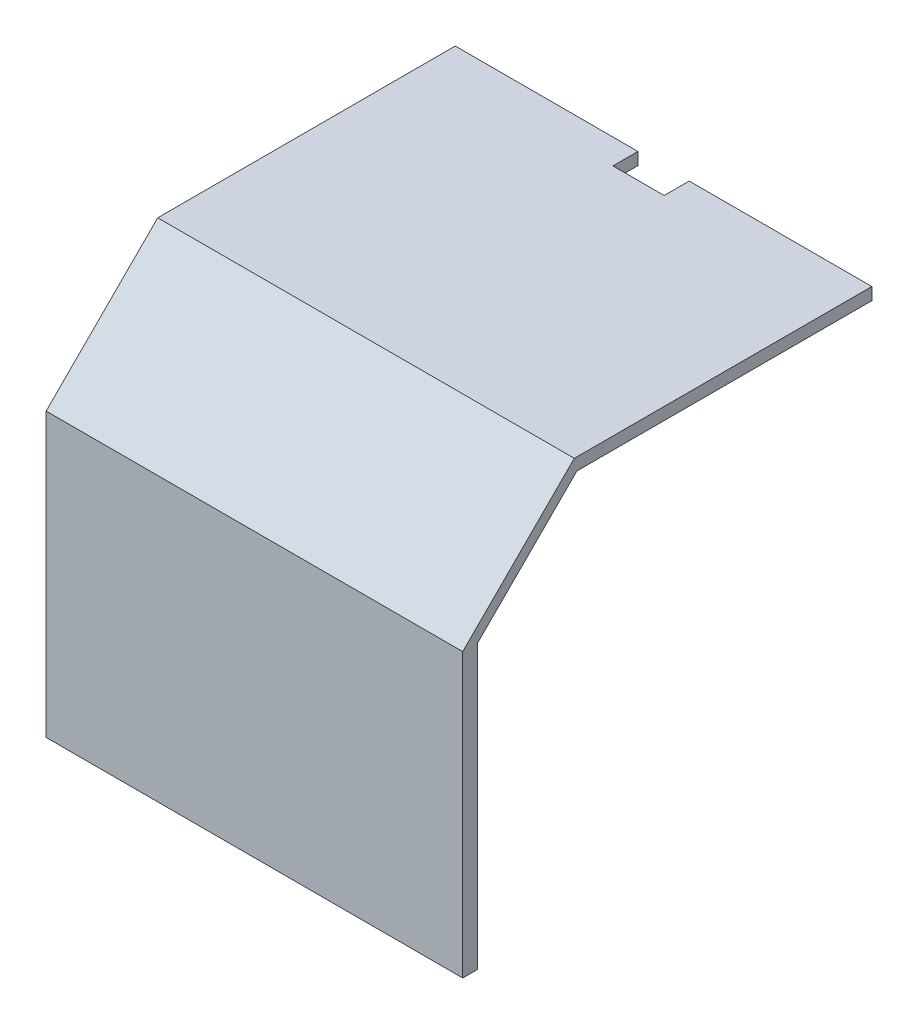
ISO-10303-21;
HEADER;
FILE_DESCRIPTION(('STEP AP214'),'2;1');
FILE_NAME('part.step','',(''),(''),'','','');
FILE_SCHEMA(('AUTOMOTIVE_DESIGN { 1 0 10303 214 1 1 1 1 }'));
ENDSEC;
DATA;
#1=APPLICATION_CONTEXT('core data for automotive mechanical design processes');
#2=APPLICATION_PROTOCOL_DEFINITION('international standard','automotive_design',2000,#1);
#3=PRODUCT_CONTEXT('',#1,'mechanical');
#4=PRODUCT('Part','Part','',(#3));
#5=PRODUCT_RELATED_PRODUCT_CATEGORY('part','',(#4));
#6=PRODUCT_DEFINITION_FORMATION('','',#4);
#7=PRODUCT_DEFINITION_CONTEXT('part definition',#1,'design');
#8=PRODUCT_DEFINITION('design','',#6,#7);
#9=PRODUCT_DEFINITION_SHAPE('','',#8);
#10=(LENGTH_UNIT() NAMED_UNIT(*) SI_UNIT(.MILLI.,.METRE.));
#11=(NAMED_UNIT(*) PLANE_ANGLE_UNIT() SI_UNIT($,.RADIAN.));
#12=(NAMED_UNIT(*) SI_UNIT($,.STERADIAN.) SOLID_ANGLE_UNIT());
#13=UNCERTAINTY_MEASURE_WITH_UNIT(LENGTH_MEASURE(1.E-05),#10,'distance_accuracy_value','');
#14=(GEOMETRIC_REPRESENTATION_CONTEXT(3) GLOBAL_UNCERTAINTY_ASSIGNED_CONTEXT((#13)) GLOBAL_UNIT_ASSIGNED_CONTEXT((#10,
#11,#12)) REPRESENTATION_CONTEXT('',''));
#15=CARTESIAN_POINT('',(0.,0.,0.));
#16=DIRECTION('',(0.,0.,1.));
#17=DIRECTION('',(1.,0.,0.));
#18=AXIS2_PLACEMENT_3D('',#15,#16,#17);
#19=CARTESIAN_POINT('',(-560.,1060.,-1080.));
#20=DIRECTION('',(0.,0.,-1.));
#21=DIRECTION('',(-1.,0.,0.));
#22=AXIS2_PLACEMENT_3D('',#19,#20,#21);
#23=PLANE('',#22);
#24=DIRECTION('',(0.,1.,0.));
#25=VECTOR('',#24,1.);
#26=CARTESIAN_POINT('',(-68.8845071130684,-60.0000000000012,-1080.));
#27=LINE('',#26,#25);
#28=CARTESIAN_POINT('',(-68.8845071130684,1027.,-1080.));
#29=VERTEX_POINT('',#28);
#30=CARTESIAN_POINT('',(-68.8845071130684,1060.,-1080.));
#31=VERTEX_POINT('',#30);
#32=EDGE_CURVE('E169',#29,#31,#27,.T.);
#33=ORIENTED_EDGE('',*,*,#32,.F.);
#34=DIRECTION('',(1.,0.,0.));
#35=VECTOR('',#34,1.);
#36=CARTESIAN_POINT('',(-560.,1027.,-1080.));
#37=LINE('',#36,#35);
#38=CARTESIAN_POINT('',(-560.,1027.,-1080.));
#39=VERTEX_POINT('',#38);
#40=EDGE_CURVE('E194',#39,#29,#37,.T.);
#41=ORIENTED_EDGE('',*,*,#40,.F.);
#42=DIRECTION('',(0.,1.,0.));
#43=VECTOR('',#42,1.);
#44=CARTESIAN_POINT('',(-560.,1060.,-1080.));
#45=LINE('',#44,#43);
#46=CARTESIAN_POINT('',(-560.,1060.,-1080.));
#47=VERTEX_POINT('',#46);
#48=EDGE_CURVE('E177',#39,#47,#45,.T.);
#49=ORIENTED_EDGE('',*,*,#48,.T.);
#50=DIRECTION('',(1.,0.,0.));
#51=VECTOR('',#50,1.);
#52=CARTESIAN_POINT('',(-560.,1060.,-1080.));
#53=LINE('',#52,#51);
#54=EDGE_CURVE('E189',#47,#31,#53,.T.);
#55=ORIENTED_EDGE('',*,*,#54,.T.);
#56=EDGE_LOOP('',(#33,#41,#49,#55));
#57=FACE_BOUND('',#56,.T.);
#58=ADVANCED_FACE('F39',(#57),#23,.T.);
#59=CARTESIAN_POINT('',(560.,760.,20.));
#60=DIRECTION('',(-1.,0.,0.));
#61=DIRECTION('',(0.,0.,1.));
#62=AXIS2_PLACEMENT_3D('',#59,#60,#61);
#63=PLANE('',#62);
#64=DIRECTION('',(0.,1.,0.));
#65=VECTOR('',#64,1.);
#66=CARTESIAN_POINT('',(560.,1060.,-1080.));
#67=LINE('',#66,#65);
#68=CARTESIAN_POINT('',(560.,1027.,-1080.));
#69=VERTEX_POINT('',#68);
#70=CARTESIAN_POINT('',(560.,1060.,-1080.));
#71=VERTEX_POINT('',#70);
#72=EDGE_CURVE('E178',#69,#71,#67,.T.);
#73=ORIENTED_EDGE('',*,*,#72,.T.);
#74=DIRECTION('',(0.,0.,1.));
#75=VECTOR('',#74,1.);
#76=CARTESIAN_POINT('',(560.,1060.,-319.999999999999));
#77=LINE('',#76,#75);
#78=CARTESIAN_POINT('',(560.,1060.,-279.999999999999));
#79=VERTEX_POINT('',#78);
#80=EDGE_CURVE('E215',#71,#79,#77,.T.);
#81=ORIENTED_EDGE('',*,*,#80,.T.);
#82=DIRECTION('',(0.,-0.707106781186547,0.707106781186548));
#83=VECTOR('',#82,1.);
#84=CARTESIAN_POINT('',(560.,760.,20.));
#85=LINE('',#84,#83);
#86=CARTESIAN_POINT('',(560.,760.,20.));
#87=VERTEX_POINT('',#86);
#88=EDGE_CURVE('E203',#79,#87,#85,.T.);
#89=ORIENTED_EDGE('',*,*,#88,.T.);
#90=DIRECTION('',(0.,-1.,0.));
#91=VECTOR('',#90,1.);
#92=CARTESIAN_POINT('',(560.,760.,20.));
#93=LINE('',#92,#91);
#94=CARTESIAN_POINT('',(560.,0.,20.));
#95=VERTEX_POINT('',#94);
#96=EDGE_CURVE('E231',#87,#95,#93,.T.);
#97=ORIENTED_EDGE('',*,*,#96,.T.);
#98=DIRECTION('',(0.,0.,-1.));
#99=VECTOR('',#98,1.);
#100=CARTESIAN_POINT('',(560.,0.,20.));
#101=LINE('',#100,#99);
#102=CARTESIAN_POINT('',(560.,0.,-20.));
#103=VERTEX_POINT('',#102);
#104=EDGE_CURVE('E224',#95,#103,#101,.T.);
#105=ORIENTED_EDGE('',*,*,#104,.T.);
#106=DIRECTION('',(0.,-1.,0.));
#107=VECTOR('',#106,1.);
#108=CARTESIAN_POINT('',(560.,760.,-20.));
#109=LINE('',#108,#107);
#110=CARTESIAN_POINT('',(560.,760.,-20.));
#111=VERTEX_POINT('',#110);
#112=EDGE_CURVE('E251',#111,#103,#109,.T.);
#113=ORIENTED_EDGE('',*,*,#112,.F.);
#114=DIRECTION('',(0.,0.707106781186548,-0.707106781186548));
#115=VECTOR('',#114,1.);
#116=CARTESIAN_POINT('',(560.,760.,-20.));
#117=LINE('',#116,#115);
#118=CARTESIAN_POINT('',(560.,1027.,-286.999999999999));
#119=VERTEX_POINT('',#118);
#120=EDGE_CURVE('E193',#111,#119,#117,.T.);
#121=ORIENTED_EDGE('',*,*,#120,.T.);
#122=DIRECTION('',(0.,0.,-1.));
#123=VECTOR('',#122,1.);
#124=CARTESIAN_POINT('',(560.,1027.,-1080.));
#125=LINE('',#124,#123);
#126=EDGE_CURVE('E168',#119,#69,#125,.T.);
#127=ORIENTED_EDGE('',*,*,#126,.T.);
#128=EDGE_LOOP('',(#73,#81,#89,#97,#105,#113,#121,#127));
#129=FACE_BOUND('',#128,.T.);
#130=ADVANCED_FACE('F41',(#129),#63,.F.);
#131=CARTESIAN_POINT('',(-560.,760.,-20.));
#132=DIRECTION('',(0.,0.,1.));
#133=DIRECTION('',(1.,0.,0.));
#134=AXIS2_PLACEMENT_3D('',#131,#132,#133);
#135=PLANE('',#134);
#136=DIRECTION('',(-1.,0.,0.));
#137=VECTOR('',#136,1.);
#138=CARTESIAN_POINT('',(-560.,0.,-20.));
#139=LINE('',#138,#137);
#140=CARTESIAN_POINT('',(-560.,0.,-20.));
#141=VERTEX_POINT('',#140);
#142=EDGE_CURVE('E235',#103,#141,#139,.T.);
#143=ORIENTED_EDGE('',*,*,#142,.T.);
#144=DIRECTION('',(0.,-1.,0.));
#145=VECTOR('',#144,1.);
#146=CARTESIAN_POINT('',(-560.,760.,-20.));
#147=LINE('',#146,#145);
#148=CARTESIAN_POINT('',(-560.,760.,-20.));
#149=VERTEX_POINT('',#148);
#150=EDGE_CURVE('E247',#149,#141,#147,.T.);
#151=ORIENTED_EDGE('',*,*,#150,.F.);
#152=DIRECTION('',(-1.,0.,0.));
#153=VECTOR('',#152,1.);
#154=CARTESIAN_POINT('',(-560.,760.,-20.));
#155=LINE('',#154,#153);
#156=EDGE_CURVE('E90',#111,#149,#155,.T.);
#157=ORIENTED_EDGE('',*,*,#156,.F.);
#158=ORIENTED_EDGE('',*,*,#112,.T.);
#159=EDGE_LOOP('',(#143,#151,#157,#158));
#160=FACE_BOUND('',#159,.T.);
#161=ADVANCED_FACE('F282',(#160),#135,.F.);
#162=CARTESIAN_POINT('',(-560.,760.,20.));
#163=DIRECTION('',(1.,0.,0.));
#164=DIRECTION('',(0.,0.,-1.));
#165=AXIS2_PLACEMENT_3D('',#162,#163,#164);
#166=PLANE('',#165);
#167=DIRECTION('',(0.,0.,1.));
#168=VECTOR('',#167,1.);
#169=CARTESIAN_POINT('',(-560.,1060.,-319.999999999999));
#170=LINE('',#169,#168);
#171=CARTESIAN_POINT('',(-560.,1060.,-279.999999999999));
#172=VERTEX_POINT('',#171);
#173=EDGE_CURVE('E202',#47,#172,#170,.T.);
#174=ORIENTED_EDGE('',*,*,#173,.F.);
#175=ORIENTED_EDGE('',*,*,#48,.F.);
#176=DIRECTION('',(0.,0.,-1.));
#177=VECTOR('',#176,1.);
#178=CARTESIAN_POINT('',(-560.,1027.,-1080.));
#179=LINE('',#178,#177);
#180=CARTESIAN_POINT('',(-560.,1027.,-286.999999999999));
#181=VERTEX_POINT('',#180);
#182=EDGE_CURVE('E174',#181,#39,#179,.T.);
#183=ORIENTED_EDGE('',*,*,#182,.F.);
#184=DIRECTION('',(0.,0.707106781186548,-0.707106781186548));
#185=VECTOR('',#184,1.);
#186=CARTESIAN_POINT('',(-560.,760.,-20.));
#187=LINE('',#186,#185);
#188=EDGE_CURVE('E198',#149,#181,#187,.T.);
#189=ORIENTED_EDGE('',*,*,#188,.F.);
#190=ORIENTED_EDGE('',*,*,#150,.T.);
#191=DIRECTION('',(0.,0.,1.));
#192=VECTOR('',#191,1.);
#193=CARTESIAN_POINT('',(-560.,0.,20.));
#194=LINE('',#193,#192);
#195=CARTESIAN_POINT('',(-560.,0.,20.));
#196=VERTEX_POINT('',#195);
#197=EDGE_CURVE('E238',#141,#196,#194,.T.);
#198=ORIENTED_EDGE('',*,*,#197,.T.);
#199=DIRECTION('',(0.,-1.,0.));
#200=VECTOR('',#199,1.);
#201=CARTESIAN_POINT('',(-560.,760.,20.));
#202=LINE('',#201,#200);
#203=CARTESIAN_POINT('',(-560.,760.,20.));
#204=VERTEX_POINT('',#203);
#205=EDGE_CURVE('E64',#204,#196,#202,.T.);
#206=ORIENTED_EDGE('',*,*,#205,.F.);
#207=DIRECTION('',(0.,-0.707106781186547,0.707106781186548));
#208=VECTOR('',#207,1.);
#209=CARTESIAN_POINT('',(-560.,760.,20.));
#210=LINE('',#209,#208);
#211=EDGE_CURVE('E207',#172,#204,#210,.T.);
#212=ORIENTED_EDGE('',*,*,#211,.F.);
#213=EDGE_LOOP('',(#174,#175,#183,#189,#190,#198,#206,#212));
#214=FACE_BOUND('',#213,.T.);
#215=ADVANCED_FACE('F269',(#214),#166,.F.);
#216=CARTESIAN_POINT('',(-560.,760.,20.));
#217=DIRECTION('',(0.,0.,-1.));
#218=DIRECTION('',(-1.,0.,0.));
#219=AXIS2_PLACEMENT_3D('',#216,#217,#218);
#220=PLANE('',#219);
#221=DIRECTION('',(1.,0.,0.));
#222=VECTOR('',#221,1.);
#223=CARTESIAN_POINT('',(-560.,0.,20.));
#224=LINE('',#223,#222);
#225=EDGE_CURVE('E84',#196,#95,#224,.T.);
#226=ORIENTED_EDGE('',*,*,#225,.T.);
#227=ORIENTED_EDGE('',*,*,#96,.F.);
#228=DIRECTION('',(1.,0.,0.));
#229=VECTOR('',#228,1.);
#230=CARTESIAN_POINT('',(-560.,760.,20.));
#231=LINE('',#230,#229);
#232=EDGE_CURVE('E227',#204,#87,#231,.T.);
#233=ORIENTED_EDGE('',*,*,#232,.F.);
#234=ORIENTED_EDGE('',*,*,#205,.T.);
#235=EDGE_LOOP('',(#226,#227,#233,#234));
#236=FACE_BOUND('',#235,.T.);
#237=ADVANCED_FACE('F277',(#236),#220,.F.);
#238=CARTESIAN_POINT('',(0.,0.,0.));
#239=DIRECTION('',(0.,-1.,0.));
#240=DIRECTION('',(0.,0.,-1.));
#241=AXIS2_PLACEMENT_3D('',#238,#239,#240);
#242=PLANE('',#241);
#243=ORIENTED_EDGE('',*,*,#104,.F.);
#244=ORIENTED_EDGE('',*,*,#225,.F.);
#245=ORIENTED_EDGE('',*,*,#197,.F.);
#246=ORIENTED_EDGE('',*,*,#142,.F.);
#247=EDGE_LOOP('',(#243,#244,#245,#246));
#248=FACE_BOUND('',#247,.T.);
#249=ADVANCED_FACE('F280',(#248),#242,.T.);
#250=CARTESIAN_POINT('',(-560.,760.,20.));
#251=DIRECTION('',(0.,0.707106781186548,0.707106781186548));
#252=DIRECTION('',(0.,-0.707106781186547,0.707106781186548));
#253=AXIS2_PLACEMENT_3D('',#250,#251,#252);
#254=PLANE('',#253);
#255=ORIENTED_EDGE('',*,*,#88,.F.);
#256=DIRECTION('',(1.,0.,0.));
#257=VECTOR('',#256,1.);
#258=CARTESIAN_POINT('',(-560.,1060.,-279.999999999999));
#259=LINE('',#258,#257);
#260=EDGE_CURVE('E211',#172,#79,#259,.T.);
#261=ORIENTED_EDGE('',*,*,#260,.F.);
#262=ORIENTED_EDGE('',*,*,#211,.T.);
#263=ORIENTED_EDGE('',*,*,#232,.T.);
#264=EDGE_LOOP('',(#255,#261,#262,#263));
#265=FACE_BOUND('',#264,.T.);
#266=ADVANCED_FACE('F276',(#265),#254,.T.);
#267=CARTESIAN_POINT('',(-560.,1060.,-319.999999999999));
#268=DIRECTION('',(0.,1.,0.));
#269=DIRECTION('',(0.,0.,1.));
#270=AXIS2_PLACEMENT_3D('',#267,#268,#269);
#271=PLANE('',#270);
#272=DIRECTION('',(0.,0.,1.));
#273=VECTOR('',#272,1.);
#274=CARTESIAN_POINT('',(-68.8845071130684,1060.,-1012.76205174009));
#275=LINE('',#274,#273);
#276=CARTESIAN_POINT('',(-68.8845071130684,1060.,-1012.76205174009));
#277=VERTEX_POINT('',#276);
#278=EDGE_CURVE('E145',#31,#277,#275,.T.);
#279=ORIENTED_EDGE('',*,*,#278,.F.);
#280=ORIENTED_EDGE('',*,*,#54,.F.);
#281=ORIENTED_EDGE('',*,*,#173,.T.);
#282=ORIENTED_EDGE('',*,*,#260,.T.);
#283=ORIENTED_EDGE('',*,*,#80,.F.);
#284=CARTESIAN_POINT('',(68.8845071130684,1060.,-1080.));
#285=VERTEX_POINT('',#284);
#286=EDGE_CURVE('E160',#285,#71,#53,.T.);
#287=ORIENTED_EDGE('',*,*,#286,.F.);
#288=DIRECTION('',(0.,0.,-1.));
#289=VECTOR('',#288,1.);
#290=CARTESIAN_POINT('',(68.8845071130684,1060.,-1080.));
#291=LINE('',#290,#289);
#292=CARTESIAN_POINT('',(68.8845071130684,1060.,-1012.76205174009));
#293=VERTEX_POINT('',#292);
#294=EDGE_CURVE('E140',#293,#285,#291,.T.);
#295=ORIENTED_EDGE('',*,*,#294,.F.);
#296=DIRECTION('',(1.,0.,0.));
#297=VECTOR('',#296,1.);
#298=CARTESIAN_POINT('',(68.8845071130684,1060.,-1012.76205174009));
#299=LINE('',#298,#297);
#300=EDGE_CURVE('E148',#277,#293,#299,.T.);
#301=ORIENTED_EDGE('',*,*,#300,.F.);
#302=EDGE_LOOP('',(#279,#280,#281,#282,#283,#287,#295,#301));
#303=FACE_BOUND('',#302,.T.);
#304=ADVANCED_FACE('F158',(#303),#271,.T.);
#305=CARTESIAN_POINT('',(-560.,760.,-20.));
#306=DIRECTION('',(0.,-0.707106781186548,-0.707106781186548));
#307=DIRECTION('',(0.,0.707106781186548,-0.707106781186548));
#308=AXIS2_PLACEMENT_3D('',#305,#306,#307);
#309=PLANE('',#308);
#310=DIRECTION('',(-1.,0.,0.));
#311=VECTOR('',#310,1.);
#312=CARTESIAN_POINT('',(-560.,1027.,-286.999999999999));
#313=LINE('',#312,#311);
#314=EDGE_CURVE('E254',#119,#181,#313,.T.);
#315=ORIENTED_EDGE('',*,*,#314,.F.);
#316=ORIENTED_EDGE('',*,*,#120,.F.);
#317=ORIENTED_EDGE('',*,*,#156,.T.);
#318=ORIENTED_EDGE('',*,*,#188,.T.);
#319=EDGE_LOOP('',(#315,#316,#317,#318));
#320=FACE_BOUND('',#319,.T.);
#321=ADVANCED_FACE('F286',(#320),#309,.T.);
#322=DIRECTION('',(0.,1.,0.));
#323=VECTOR('',#322,1.);
#324=CARTESIAN_POINT('',(68.8845071130684,-60.0000000000012,-1080.));
#325=LINE('',#324,#323);
#326=CARTESIAN_POINT('',(68.8845071130684,1027.,-1080.));
#327=VERTEX_POINT('',#326);
#328=EDGE_CURVE('E55',#327,#285,#325,.T.);
#329=ORIENTED_EDGE('',*,*,#328,.T.);
#330=ORIENTED_EDGE('',*,*,#286,.T.);
#331=ORIENTED_EDGE('',*,*,#72,.F.);
#332=EDGE_CURVE('E182',#327,#69,#37,.T.);
#333=ORIENTED_EDGE('',*,*,#332,.F.);
#334=EDGE_LOOP('',(#329,#330,#331,#333));
#335=FACE_BOUND('',#334,.T.);
#336=ADVANCED_FACE('F289',(#335),#23,.T.);
#337=CARTESIAN_POINT('',(-560.,1027.,-1080.));
#338=DIRECTION('',(0.,-1.,0.));
#339=DIRECTION('',(0.,0.,-1.));
#340=AXIS2_PLACEMENT_3D('',#337,#338,#339);
#341=PLANE('',#340);
#342=DIRECTION('',(0.,0.,-1.));
#343=VECTOR('',#342,1.);
#344=CARTESIAN_POINT('',(-68.8845071130684,1027.,-1080.));
#345=LINE('',#344,#343);
#346=CARTESIAN_POINT('',(-68.8845071130684,1027.,-1012.76205174009));
#347=VERTEX_POINT('',#346);
#348=EDGE_CURVE('E11',#347,#29,#345,.T.);
#349=ORIENTED_EDGE('',*,*,#348,.F.);
#350=DIRECTION('',(-1.,0.,0.));
#351=VECTOR('',#350,1.);
#352=CARTESIAN_POINT('',(-560.,1027.,-1012.76205174009));
#353=LINE('',#352,#351);
#354=CARTESIAN_POINT('',(68.8845071130684,1027.,-1012.76205174009));
#355=VERTEX_POINT('',#354);
#356=EDGE_CURVE('E48',#355,#347,#353,.T.);
#357=ORIENTED_EDGE('',*,*,#356,.F.);
#358=DIRECTION('',(0.,0.,1.));
#359=VECTOR('',#358,1.);
#360=CARTESIAN_POINT('',(68.8845071130684,1027.,-1080.));
#361=LINE('',#360,#359);
#362=EDGE_CURVE('E141',#327,#355,#361,.T.);
#363=ORIENTED_EDGE('',*,*,#362,.F.);
#364=ORIENTED_EDGE('',*,*,#332,.T.);
#365=ORIENTED_EDGE('',*,*,#126,.F.);
#366=ORIENTED_EDGE('',*,*,#314,.T.);
#367=ORIENTED_EDGE('',*,*,#182,.T.);
#368=ORIENTED_EDGE('',*,*,#40,.T.);
#369=EDGE_LOOP('',(#349,#357,#363,#364,#365,#366,#367,#368));
#370=FACE_BOUND('',#369,.T.);
#371=ADVANCED_FACE('F264',(#370),#341,.T.);
#372=CARTESIAN_POINT('',(68.8845071130684,-60.0000000000012,-1012.76205174009));
#373=DIRECTION('',(0.,0.,1.));
#374=DIRECTION('',(1.,0.,0.));
#375=AXIS2_PLACEMENT_3D('',#372,#373,#374);
#376=PLANE('',#375);
#377=ORIENTED_EDGE('',*,*,#356,.T.);
#378=DIRECTION('',(0.,1.,0.));
#379=VECTOR('',#378,1.);
#380=CARTESIAN_POINT('',(-68.8845071130684,-60.0000000000012,-1012.76205174009));
#381=LINE('',#380,#379);
#382=EDGE_CURVE('E151',#347,#277,#381,.T.);
#383=ORIENTED_EDGE('',*,*,#382,.T.);
#384=ORIENTED_EDGE('',*,*,#300,.T.);
#385=DIRECTION('',(0.,1.,0.));
#386=VECTOR('',#385,1.);
#387=CARTESIAN_POINT('',(68.8845071130684,-60.0000000000012,-1012.76205174009));
#388=LINE('',#387,#386);
#389=EDGE_CURVE('E136',#355,#293,#388,.T.);
#390=ORIENTED_EDGE('',*,*,#389,.F.);
#391=EDGE_LOOP('',(#377,#383,#384,#390));
#392=FACE_BOUND('',#391,.T.);
#393=ADVANCED_FACE('F149',(#392),#376,.F.);
#394=CARTESIAN_POINT('',(-68.8845071130684,-60.0000000000012,-1012.76205174009));
#395=DIRECTION('',(-1.,0.,0.));
#396=DIRECTION('',(0.,0.,1.));
#397=AXIS2_PLACEMENT_3D('',#394,#395,#396);
#398=PLANE('',#397);
#399=ORIENTED_EDGE('',*,*,#348,.T.);
#400=ORIENTED_EDGE('',*,*,#32,.T.);
#401=ORIENTED_EDGE('',*,*,#278,.T.);
#402=ORIENTED_EDGE('',*,*,#382,.F.);
#403=EDGE_LOOP('',(#399,#400,#401,#402));
#404=FACE_BOUND('',#403,.T.);
#405=ADVANCED_FACE('F262',(#404),#398,.F.);
#406=CARTESIAN_POINT('',(68.8845071130684,-60.0000000000012,-1080.));
#407=DIRECTION('',(1.,0.,0.));
#408=DIRECTION('',(0.,0.,-1.));
#409=AXIS2_PLACEMENT_3D('',#406,#407,#408);
#410=PLANE('',#409);
#411=ORIENTED_EDGE('',*,*,#362,.T.);
#412=ORIENTED_EDGE('',*,*,#389,.T.);
#413=ORIENTED_EDGE('',*,*,#294,.T.);
#414=ORIENTED_EDGE('',*,*,#328,.F.);
#415=EDGE_LOOP('',(#411,#412,#413,#414));
#416=FACE_BOUND('',#415,.T.);
#417=ADVANCED_FACE('F138',(#416),#410,.F.);
#418=CLOSED_SHELL('',(#58,#130,#161,#215,#237,#249,#266,#304,#321,#336,#371,#393,#405,#417));
#419=MANIFOLD_SOLID_BREP('B2',#418);
#420=ADVANCED_BREP_SHAPE_REPRESENTATION('',(#18,#419),#14);
#421=SHAPE_DEFINITION_REPRESENTATION(#9,#420);
ENDSEC;
END-ISO-10303-21;
